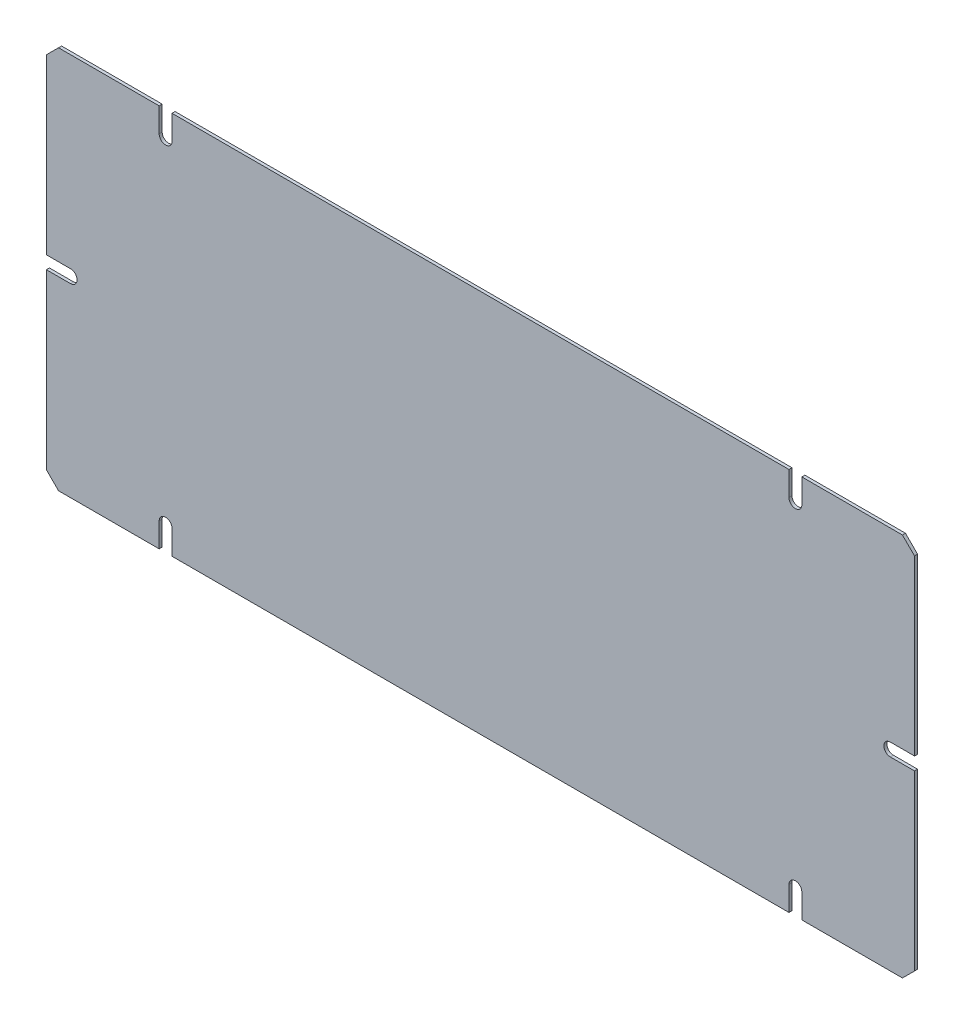
ISO-10303-21;
HEADER;
FILE_DESCRIPTION(('STEP AP214'),'2;1');
FILE_NAME('part.step','',(''),(''),'','','');
FILE_SCHEMA(('AUTOMOTIVE_DESIGN { 1 0 10303 214 1 1 1 1 }'));
ENDSEC;
DATA;
#1=APPLICATION_CONTEXT('core data for automotive mechanical design processes');
#2=APPLICATION_PROTOCOL_DEFINITION('international standard','automotive_design',2000,#1);
#3=PRODUCT_CONTEXT('',#1,'mechanical');
#4=PRODUCT('Part','Part','',(#3));
#5=PRODUCT_RELATED_PRODUCT_CATEGORY('part','',(#4));
#6=PRODUCT_DEFINITION_FORMATION('','',#4);
#7=PRODUCT_DEFINITION_CONTEXT('part definition',#1,'design');
#8=PRODUCT_DEFINITION('design','',#6,#7);
#9=PRODUCT_DEFINITION_SHAPE('','',#8);
#10=(LENGTH_UNIT() NAMED_UNIT(*) SI_UNIT(.MILLI.,.METRE.));
#11=(NAMED_UNIT(*) PLANE_ANGLE_UNIT() SI_UNIT($,.RADIAN.));
#12=(NAMED_UNIT(*) SI_UNIT($,.STERADIAN.) SOLID_ANGLE_UNIT());
#13=UNCERTAINTY_MEASURE_WITH_UNIT(LENGTH_MEASURE(1.E-05),#10,'distance_accuracy_value','');
#14=(GEOMETRIC_REPRESENTATION_CONTEXT(3) GLOBAL_UNCERTAINTY_ASSIGNED_CONTEXT((#13)) GLOBAL_UNIT_ASSIGNED_CONTEXT((#10,
#11,#12)) REPRESENTATION_CONTEXT('',''));
#15=CARTESIAN_POINT('',(0.,0.,0.));
#16=DIRECTION('',(0.,0.,1.));
#17=DIRECTION('',(1.,0.,0.));
#18=AXIS2_PLACEMENT_3D('',#15,#16,#17);
#19=CARTESIAN_POINT('',(0.,0.,1.5875));
#20=DIRECTION('',(0.,0.,1.));
#21=DIRECTION('',(1.,0.,0.));
#22=AXIS2_PLACEMENT_3D('',#19,#20,#21);
#23=PLANE('',#22);
#24=CARTESIAN_POINT('',(214.884,0.,1.5875));
#25=DIRECTION('',(0.,0.,1.));
#26=DIRECTION('',(1.,0.,0.));
#27=AXIS2_PLACEMENT_3D('',#24,#25,#26);
#28=CIRCLE('',#27,3.3782);
#29=CARTESIAN_POINT('',(214.884,3.37820000000003,1.5875));
#30=VERTEX_POINT('',#29);
#31=CARTESIAN_POINT('',(214.884,-3.37819999999997,1.5875));
#32=VERTEX_POINT('',#31);
#33=EDGE_CURVE('E276',#30,#32,#28,.T.);
#34=ORIENTED_EDGE('',*,*,#33,.F.);
#35=DIRECTION('',(1.,0.,0.));
#36=VECTOR('',#35,1.);
#37=CARTESIAN_POINT('',(214.884,3.37820000000003,1.5875));
#38=LINE('',#37,#36);
#39=CARTESIAN_POINT('',(227.584,3.37820000000003,1.5875));
#40=VERTEX_POINT('',#39);
#41=EDGE_CURVE('E61',#30,#40,#38,.T.);
#42=ORIENTED_EDGE('',*,*,#41,.T.);
#43=DIRECTION('',(0.,1.,0.));
#44=VECTOR('',#43,1.);
#45=CARTESIAN_POINT('',(227.584,100.584,1.5875));
#46=LINE('',#45,#44);
#47=CARTESIAN_POINT('',(227.584,94.2340000000001,1.5875));
#48=VERTEX_POINT('',#47);
#49=EDGE_CURVE('E303',#40,#48,#46,.T.);
#50=ORIENTED_EDGE('',*,*,#49,.T.);
#51=DIRECTION('',(0.707106781186548,-0.707106781186548,0.));
#52=VECTOR('',#51,1.);
#53=CARTESIAN_POINT('',(160.909,160.909,1.5875));
#54=LINE('',#53,#52);
#55=CARTESIAN_POINT('',(221.234,100.584,1.5875));
#56=VERTEX_POINT('',#55);
#57=EDGE_CURVE('E357',#48,#56,#54,.F.);
#58=ORIENTED_EDGE('',*,*,#57,.T.);
#59=DIRECTION('',(-1.,0.,0.));
#60=VECTOR('',#59,1.);
#61=CARTESIAN_POINT('',(-227.584,100.584,1.5875));
#62=LINE('',#61,#60);
#63=CARTESIAN_POINT('',(168.4782,100.584,1.5875));
#64=VERTEX_POINT('',#63);
#65=EDGE_CURVE('E304',#56,#64,#62,.T.);
#66=ORIENTED_EDGE('',*,*,#65,.T.);
#67=DIRECTION('',(0.,1.,0.));
#68=VECTOR('',#67,1.);
#69=CARTESIAN_POINT('',(168.4782,87.884,1.5875));
#70=LINE('',#69,#68);
#71=CARTESIAN_POINT('',(168.4782,87.884,1.5875));
#72=VERTEX_POINT('',#71);
#73=EDGE_CURVE('E402',#72,#64,#70,.T.);
#74=ORIENTED_EDGE('',*,*,#73,.F.);
#75=CARTESIAN_POINT('',(165.1,87.884,1.5875));
#76=DIRECTION('',(0.,0.,1.));
#77=DIRECTION('',(1.,0.,0.));
#78=AXIS2_PLACEMENT_3D('',#75,#76,#77);
#79=CIRCLE('',#78,3.3782);
#80=CARTESIAN_POINT('',(161.7218,87.884,1.5875));
#81=VERTEX_POINT('',#80);
#82=EDGE_CURVE('E412',#81,#72,#79,.T.);
#83=ORIENTED_EDGE('',*,*,#82,.F.);
#84=DIRECTION('',(0.,-1.,0.));
#85=VECTOR('',#84,1.);
#86=CARTESIAN_POINT('',(161.7218,87.884,1.5875));
#87=LINE('',#86,#85);
#88=CARTESIAN_POINT('',(161.7218,100.584,1.5875));
#89=VERTEX_POINT('',#88);
#90=EDGE_CURVE('E400',#89,#81,#87,.T.);
#91=ORIENTED_EDGE('',*,*,#90,.F.);
#92=CARTESIAN_POINT('',(-161.7218,100.584,1.5875));
#93=VERTEX_POINT('',#92);
#94=EDGE_CURVE('E308',#89,#93,#62,.T.);
#95=ORIENTED_EDGE('',*,*,#94,.T.);
#96=DIRECTION('',(0.,1.,0.));
#97=VECTOR('',#96,1.);
#98=CARTESIAN_POINT('',(-161.7218,87.884,1.5875));
#99=LINE('',#98,#97);
#100=CARTESIAN_POINT('',(-161.7218,87.884,1.5875));
#101=VERTEX_POINT('',#100);
#102=EDGE_CURVE('E409',#101,#93,#99,.T.);
#103=ORIENTED_EDGE('',*,*,#102,.F.);
#104=CARTESIAN_POINT('',(-165.1,87.884,1.5875));
#105=DIRECTION('',(0.,0.,1.));
#106=DIRECTION('',(1.,0.,0.));
#107=AXIS2_PLACEMENT_3D('',#104,#105,#106);
#108=CIRCLE('',#107,3.3782);
#109=CARTESIAN_POINT('',(-168.4782,87.884,1.5875));
#110=VERTEX_POINT('',#109);
#111=EDGE_CURVE('E405',#110,#101,#108,.T.);
#112=ORIENTED_EDGE('',*,*,#111,.F.);
#113=DIRECTION('',(0.,-1.,0.));
#114=VECTOR('',#113,1.);
#115=CARTESIAN_POINT('',(-168.4782,87.884,1.5875));
#116=LINE('',#115,#114);
#117=CARTESIAN_POINT('',(-168.4782,100.584,1.5875));
#118=VERTEX_POINT('',#117);
#119=EDGE_CURVE('E440',#118,#110,#116,.T.);
#120=ORIENTED_EDGE('',*,*,#119,.F.);
#121=CARTESIAN_POINT('',(-221.234,100.584,1.5875));
#122=VERTEX_POINT('',#121);
#123=EDGE_CURVE('E302',#118,#122,#62,.T.);
#124=ORIENTED_EDGE('',*,*,#123,.T.);
#125=DIRECTION('',(0.707106781186548,0.707106781186548,0.));
#126=VECTOR('',#125,1.);
#127=CARTESIAN_POINT('',(-160.909,160.909,1.5875));
#128=LINE('',#127,#126);
#129=CARTESIAN_POINT('',(-227.584,94.2340000000001,1.5875));
#130=VERTEX_POINT('',#129);
#131=EDGE_CURVE('E361',#122,#130,#128,.F.);
#132=ORIENTED_EDGE('',*,*,#131,.T.);
#133=DIRECTION('',(0.,-1.,0.));
#134=VECTOR('',#133,1.);
#135=CARTESIAN_POINT('',(-227.584,100.584,1.5875));
#136=LINE('',#135,#134);
#137=CARTESIAN_POINT('',(-227.584,3.37820000000003,1.5875));
#138=VERTEX_POINT('',#137);
#139=EDGE_CURVE('E309',#130,#138,#136,.T.);
#140=ORIENTED_EDGE('',*,*,#139,.T.);
#141=DIRECTION('',(-1.,0.,0.));
#142=VECTOR('',#141,1.);
#143=CARTESIAN_POINT('',(-214.884,3.37820000000003,1.5875));
#144=LINE('',#143,#142);
#145=CARTESIAN_POINT('',(-214.884,3.37820000000003,1.5875));
#146=VERTEX_POINT('',#145);
#147=EDGE_CURVE('E465',#146,#138,#144,.T.);
#148=ORIENTED_EDGE('',*,*,#147,.F.);
#149=CARTESIAN_POINT('',(-214.884,0.,1.5875));
#150=DIRECTION('',(0.,0.,1.));
#151=DIRECTION('',(1.,0.,0.));
#152=AXIS2_PLACEMENT_3D('',#149,#150,#151);
#153=CIRCLE('',#152,3.3782);
#154=CARTESIAN_POINT('',(-214.884,-3.37819999999997,1.5875));
#155=VERTEX_POINT('',#154);
#156=EDGE_CURVE('E275',#155,#146,#153,.T.);
#157=ORIENTED_EDGE('',*,*,#156,.F.);
#158=DIRECTION('',(1.,0.,0.));
#159=VECTOR('',#158,1.);
#160=CARTESIAN_POINT('',(-214.884,-3.37819999999997,1.5875));
#161=LINE('',#160,#159);
#162=CARTESIAN_POINT('',(-227.584,-3.37819999999997,1.5875));
#163=VERTEX_POINT('',#162);
#164=EDGE_CURVE('E460',#163,#155,#161,.T.);
#165=ORIENTED_EDGE('',*,*,#164,.F.);
#166=CARTESIAN_POINT('',(-227.584,-94.234,1.5875));
#167=VERTEX_POINT('',#166);
#168=EDGE_CURVE('E307',#163,#167,#136,.T.);
#169=ORIENTED_EDGE('',*,*,#168,.T.);
#170=DIRECTION('',(-0.707106781186548,0.707106781186548,0.));
#171=VECTOR('',#170,1.);
#172=CARTESIAN_POINT('',(-160.909,-160.909,1.5875));
#173=LINE('',#172,#171);
#174=CARTESIAN_POINT('',(-221.234,-100.584,1.5875));
#175=VERTEX_POINT('',#174);
#176=EDGE_CURVE('E363',#167,#175,#173,.F.);
#177=ORIENTED_EDGE('',*,*,#176,.T.);
#178=DIRECTION('',(1.,0.,0.));
#179=VECTOR('',#178,1.);
#180=CARTESIAN_POINT('',(-227.584,-100.584,1.5875));
#181=LINE('',#180,#179);
#182=CARTESIAN_POINT('',(-168.4782,-100.584,1.5875));
#183=VERTEX_POINT('',#182);
#184=EDGE_CURVE('E313',#175,#183,#181,.T.);
#185=ORIENTED_EDGE('',*,*,#184,.T.);
#186=DIRECTION('',(0.,1.,0.));
#187=VECTOR('',#186,1.);
#188=CARTESIAN_POINT('',(-168.4782,-87.884,1.5875));
#189=LINE('',#188,#187);
#190=CARTESIAN_POINT('',(-168.4782,-87.884,1.5875));
#191=VERTEX_POINT('',#190);
#192=EDGE_CURVE('E485',#183,#191,#189,.T.);
#193=ORIENTED_EDGE('',*,*,#192,.T.);
#194=CARTESIAN_POINT('',(-165.1,-87.884,1.5875));
#195=DIRECTION('',(0.,0.,1.));
#196=DIRECTION('',(1.,0.,0.));
#197=AXIS2_PLACEMENT_3D('',#194,#195,#196);
#198=CIRCLE('',#197,3.3782);
#199=CARTESIAN_POINT('',(-161.7218,-87.884,1.5875));
#200=VERTEX_POINT('',#199);
#201=EDGE_CURVE('E287',#200,#191,#198,.T.);
#202=ORIENTED_EDGE('',*,*,#201,.F.);
#203=DIRECTION('',(0.,-1.,0.));
#204=VECTOR('',#203,1.);
#205=CARTESIAN_POINT('',(-161.7218,-87.884,1.5875));
#206=LINE('',#205,#204);
#207=CARTESIAN_POINT('',(-161.7218,-100.584,1.5875));
#208=VERTEX_POINT('',#207);
#209=EDGE_CURVE('E488',#200,#208,#206,.T.);
#210=ORIENTED_EDGE('',*,*,#209,.T.);
#211=CARTESIAN_POINT('',(161.7218,-100.584,1.5875));
#212=VERTEX_POINT('',#211);
#213=EDGE_CURVE('E317',#208,#212,#181,.T.);
#214=ORIENTED_EDGE('',*,*,#213,.T.);
#215=DIRECTION('',(0.,1.,0.));
#216=VECTOR('',#215,1.);
#217=CARTESIAN_POINT('',(161.7218,-87.884,1.5875));
#218=LINE('',#217,#216);
#219=CARTESIAN_POINT('',(161.7218,-87.884,1.5875));
#220=VERTEX_POINT('',#219);
#221=EDGE_CURVE('E505',#212,#220,#218,.T.);
#222=ORIENTED_EDGE('',*,*,#221,.T.);
#223=CARTESIAN_POINT('',(165.1,-87.884,1.5875));
#224=DIRECTION('',(0.,0.,1.));
#225=DIRECTION('',(1.,0.,0.));
#226=AXIS2_PLACEMENT_3D('',#223,#224,#225);
#227=CIRCLE('',#226,3.3782);
#228=CARTESIAN_POINT('',(168.4782,-87.884,1.5875));
#229=VERTEX_POINT('',#228);
#230=EDGE_CURVE('E293',#229,#220,#227,.T.);
#231=ORIENTED_EDGE('',*,*,#230,.F.);
#232=DIRECTION('',(0.,-1.,0.));
#233=VECTOR('',#232,1.);
#234=CARTESIAN_POINT('',(168.4782,-87.884,1.5875));
#235=LINE('',#234,#233);
#236=CARTESIAN_POINT('',(168.4782,-100.584,1.5875));
#237=VERTEX_POINT('',#236);
#238=EDGE_CURVE('E508',#229,#237,#235,.T.);
#239=ORIENTED_EDGE('',*,*,#238,.T.);
#240=CARTESIAN_POINT('',(221.234,-100.584,1.5875));
#241=VERTEX_POINT('',#240);
#242=EDGE_CURVE('E312',#237,#241,#181,.T.);
#243=ORIENTED_EDGE('',*,*,#242,.T.);
#244=DIRECTION('',(-0.707106781186548,-0.707106781186548,0.));
#245=VECTOR('',#244,1.);
#246=CARTESIAN_POINT('',(160.909,-160.909,1.5875));
#247=LINE('',#246,#245);
#248=CARTESIAN_POINT('',(227.584,-94.2340000000001,1.5875));
#249=VERTEX_POINT('',#248);
#250=EDGE_CURVE('E359',#241,#249,#247,.F.);
#251=ORIENTED_EDGE('',*,*,#250,.T.);
#252=CARTESIAN_POINT('',(227.584,-3.37819999999997,1.5875));
#253=VERTEX_POINT('',#252);
#254=EDGE_CURVE('E299',#249,#253,#46,.T.);
#255=ORIENTED_EDGE('',*,*,#254,.T.);
#256=DIRECTION('',(-1.,0.,0.));
#257=VECTOR('',#256,1.);
#258=CARTESIAN_POINT('',(214.884,-3.37819999999997,1.5875));
#259=LINE('',#258,#257);
#260=EDGE_CURVE('E271',#253,#32,#259,.T.);
#261=ORIENTED_EDGE('',*,*,#260,.T.);
#262=EDGE_LOOP('',(#34,#42,#50,#58,#66,#74,#83,#91,#95,#103,#112,#120,#124,#132,#140,#148,#157,
#165,#169,#177,#185,#193,#202,#210,#214,#222,#231,#239,#243,#251,#255,#261));
#263=FACE_BOUND('',#262,.T.);
#264=ADVANCED_FACE('F46',(#263),#23,.T.);
#265=CARTESIAN_POINT('',(0.,0.,0.));
#266=DIRECTION('',(0.,0.,1.));
#267=DIRECTION('',(1.,0.,0.));
#268=AXIS2_PLACEMENT_3D('',#265,#266,#267);
#269=PLANE('',#268);
#270=DIRECTION('',(-1.,0.,0.));
#271=VECTOR('',#270,1.);
#272=CARTESIAN_POINT('',(214.884,3.37820000000003,0.));
#273=LINE('',#272,#271);
#274=CARTESIAN_POINT('',(227.584,3.37819999999998,0.));
#275=VERTEX_POINT('',#274);
#276=CARTESIAN_POINT('',(214.884,3.37820000000003,0.));
#277=VERTEX_POINT('',#276);
#278=EDGE_CURVE('E255',#275,#277,#273,.T.);
#279=ORIENTED_EDGE('',*,*,#278,.T.);
#280=CARTESIAN_POINT('',(214.884,0.,0.));
#281=DIRECTION('',(0.,0.,1.));
#282=DIRECTION('',(1.,0.,0.));
#283=AXIS2_PLACEMENT_3D('',#280,#281,#282);
#284=CIRCLE('',#283,3.3782);
#285=CARTESIAN_POINT('',(214.884,-3.37819999999997,0.));
#286=VERTEX_POINT('',#285);
#287=EDGE_CURVE('E268',#277,#286,#284,.T.);
#288=ORIENTED_EDGE('',*,*,#287,.T.);
#289=DIRECTION('',(1.,0.,0.));
#290=VECTOR('',#289,1.);
#291=CARTESIAN_POINT('',(214.884,-3.37819999999997,0.));
#292=LINE('',#291,#290);
#293=CARTESIAN_POINT('',(227.584,-3.37819999999997,0.));
#294=VERTEX_POINT('',#293);
#295=EDGE_CURVE('E69',#286,#294,#292,.T.);
#296=ORIENTED_EDGE('',*,*,#295,.T.);
#297=DIRECTION('',(0.,1.,0.));
#298=VECTOR('',#297,1.);
#299=CARTESIAN_POINT('',(227.584,100.584,0.));
#300=LINE('',#299,#298);
#301=CARTESIAN_POINT('',(227.584,-94.2340000000001,0.));
#302=VERTEX_POINT('',#301);
#303=EDGE_CURVE('E318',#302,#294,#300,.T.);
#304=ORIENTED_EDGE('',*,*,#303,.F.);
#305=DIRECTION('',(0.707106781186548,0.707106781186548,0.));
#306=VECTOR('',#305,1.);
#307=CARTESIAN_POINT('',(227.584,-94.2340000000001,0.));
#308=LINE('',#307,#306);
#309=CARTESIAN_POINT('',(221.234,-100.584,0.));
#310=VERTEX_POINT('',#309);
#311=EDGE_CURVE('E342',#302,#310,#308,.F.);
#312=ORIENTED_EDGE('',*,*,#311,.T.);
#313=DIRECTION('',(1.,0.,0.));
#314=VECTOR('',#313,1.);
#315=CARTESIAN_POINT('',(-227.584,-100.584,0.));
#316=LINE('',#315,#314);
#317=CARTESIAN_POINT('',(168.4782,-100.584,0.));
#318=VERTEX_POINT('',#317);
#319=EDGE_CURVE('E330',#318,#310,#316,.T.);
#320=ORIENTED_EDGE('',*,*,#319,.F.);
#321=DIRECTION('',(0.,1.,0.));
#322=VECTOR('',#321,1.);
#323=CARTESIAN_POINT('',(168.4782,-87.884,0.));
#324=LINE('',#323,#322);
#325=CARTESIAN_POINT('',(168.4782,-87.884,0.));
#326=VERTEX_POINT('',#325);
#327=EDGE_CURVE('E473',#318,#326,#324,.T.);
#328=ORIENTED_EDGE('',*,*,#327,.T.);
#329=CARTESIAN_POINT('',(165.1,-87.884,0.));
#330=DIRECTION('',(0.,0.,1.));
#331=DIRECTION('',(1.,0.,0.));
#332=AXIS2_PLACEMENT_3D('',#329,#330,#331);
#333=CIRCLE('',#332,3.3782);
#334=CARTESIAN_POINT('',(161.7218,-87.884,0.));
#335=VERTEX_POINT('',#334);
#336=EDGE_CURVE('E296',#326,#335,#333,.T.);
#337=ORIENTED_EDGE('',*,*,#336,.T.);
#338=DIRECTION('',(0.,-1.,0.));
#339=VECTOR('',#338,1.);
#340=CARTESIAN_POINT('',(161.7218,-87.884,0.));
#341=LINE('',#340,#339);
#342=CARTESIAN_POINT('',(161.7218,-100.584,0.));
#343=VERTEX_POINT('',#342);
#344=EDGE_CURVE('E502',#335,#343,#341,.T.);
#345=ORIENTED_EDGE('',*,*,#344,.T.);
#346=CARTESIAN_POINT('',(-161.7218,-100.584,0.));
#347=VERTEX_POINT('',#346);
#348=EDGE_CURVE('E334',#347,#343,#316,.T.);
#349=ORIENTED_EDGE('',*,*,#348,.F.);
#350=DIRECTION('',(0.,1.,0.));
#351=VECTOR('',#350,1.);
#352=CARTESIAN_POINT('',(-161.7218,-87.884,0.));
#353=LINE('',#352,#351);
#354=CARTESIAN_POINT('',(-161.7218,-87.884,0.));
#355=VERTEX_POINT('',#354);
#356=EDGE_CURVE('E491',#347,#355,#353,.T.);
#357=ORIENTED_EDGE('',*,*,#356,.T.);
#358=CARTESIAN_POINT('',(-165.1,-87.884,0.));
#359=DIRECTION('',(0.,0.,1.));
#360=DIRECTION('',(1.,0.,0.));
#361=AXIS2_PLACEMENT_3D('',#358,#359,#360);
#362=CIRCLE('',#361,3.3782);
#363=CARTESIAN_POINT('',(-168.4782,-87.884,0.));
#364=VERTEX_POINT('',#363);
#365=EDGE_CURVE('E290',#355,#364,#362,.T.);
#366=ORIENTED_EDGE('',*,*,#365,.T.);
#367=DIRECTION('',(0.,-1.,0.));
#368=VECTOR('',#367,1.);
#369=CARTESIAN_POINT('',(-168.4782,-87.884,0.));
#370=LINE('',#369,#368);
#371=CARTESIAN_POINT('',(-168.4782,-100.584,0.));
#372=VERTEX_POINT('',#371);
#373=EDGE_CURVE('E482',#364,#372,#370,.T.);
#374=ORIENTED_EDGE('',*,*,#373,.T.);
#375=CARTESIAN_POINT('',(-221.234,-100.584,0.));
#376=VERTEX_POINT('',#375);
#377=EDGE_CURVE('E331',#376,#372,#316,.T.);
#378=ORIENTED_EDGE('',*,*,#377,.F.);
#379=DIRECTION('',(0.707106781186548,-0.707106781186548,0.));
#380=VECTOR('',#379,1.);
#381=CARTESIAN_POINT('',(-221.234,-100.584,0.));
#382=LINE('',#381,#380);
#383=CARTESIAN_POINT('',(-227.584,-94.234,0.));
#384=VERTEX_POINT('',#383);
#385=EDGE_CURVE('E348',#376,#384,#382,.F.);
#386=ORIENTED_EDGE('',*,*,#385,.T.);
#387=DIRECTION('',(0.,-1.,0.));
#388=VECTOR('',#387,1.);
#389=CARTESIAN_POINT('',(-227.584,100.584,0.));
#390=LINE('',#389,#388);
#391=CARTESIAN_POINT('',(-227.584,-3.37819999999997,0.));
#392=VERTEX_POINT('',#391);
#393=EDGE_CURVE('E325',#392,#384,#390,.T.);
#394=ORIENTED_EDGE('',*,*,#393,.F.);
#395=DIRECTION('',(-1.,0.,0.));
#396=VECTOR('',#395,1.);
#397=CARTESIAN_POINT('',(-214.884,-3.37819999999997,0.));
#398=LINE('',#397,#396);
#399=CARTESIAN_POINT('',(-214.884,-3.37819999999997,0.));
#400=VERTEX_POINT('',#399);
#401=EDGE_CURVE('E603',#400,#392,#398,.T.);
#402=ORIENTED_EDGE('',*,*,#401,.F.);
#403=CARTESIAN_POINT('',(-214.884,0.,0.));
#404=DIRECTION('',(0.,0.,1.));
#405=DIRECTION('',(1.,0.,0.));
#406=AXIS2_PLACEMENT_3D('',#403,#404,#405);
#407=CIRCLE('',#406,3.3782);
#408=CARTESIAN_POINT('',(-214.884,3.37820000000003,0.));
#409=VERTEX_POINT('',#408);
#410=EDGE_CURVE('E279',#400,#409,#407,.T.);
#411=ORIENTED_EDGE('',*,*,#410,.T.);
#412=DIRECTION('',(1.,0.,0.));
#413=VECTOR('',#412,1.);
#414=CARTESIAN_POINT('',(-214.884,3.37820000000003,0.));
#415=LINE('',#414,#413);
#416=CARTESIAN_POINT('',(-227.584,3.37819999999998,0.));
#417=VERTEX_POINT('',#416);
#418=EDGE_CURVE('E454',#417,#409,#415,.T.);
#419=ORIENTED_EDGE('',*,*,#418,.F.);
#420=CARTESIAN_POINT('',(-227.584,94.2340000000001,0.));
#421=VERTEX_POINT('',#420);
#422=EDGE_CURVE('E327',#421,#417,#390,.T.);
#423=ORIENTED_EDGE('',*,*,#422,.F.);
#424=DIRECTION('',(-0.707106781186548,-0.707106781186548,0.));
#425=VECTOR('',#424,1.);
#426=CARTESIAN_POINT('',(-227.584,94.2340000000001,0.));
#427=LINE('',#426,#425);
#428=CARTESIAN_POINT('',(-221.234,100.584,0.));
#429=VERTEX_POINT('',#428);
#430=EDGE_CURVE('E345',#421,#429,#427,.F.);
#431=ORIENTED_EDGE('',*,*,#430,.T.);
#432=DIRECTION('',(-1.,0.,0.));
#433=VECTOR('',#432,1.);
#434=CARTESIAN_POINT('',(-227.584,100.584,0.));
#435=LINE('',#434,#433);
#436=CARTESIAN_POINT('',(-168.4782,100.584,0.));
#437=VERTEX_POINT('',#436);
#438=EDGE_CURVE('E321',#437,#429,#435,.T.);
#439=ORIENTED_EDGE('',*,*,#438,.F.);
#440=DIRECTION('',(0.,1.,0.));
#441=VECTOR('',#440,1.);
#442=CARTESIAN_POINT('',(-168.4782,87.884,0.));
#443=LINE('',#442,#441);
#444=CARTESIAN_POINT('',(-168.4782,87.884,0.));
#445=VERTEX_POINT('',#444);
#446=EDGE_CURVE('E521',#445,#437,#443,.T.);
#447=ORIENTED_EDGE('',*,*,#446,.F.);
#448=CARTESIAN_POINT('',(-165.1,87.884,0.));
#449=DIRECTION('',(0.,0.,1.));
#450=DIRECTION('',(1.,0.,0.));
#451=AXIS2_PLACEMENT_3D('',#448,#449,#450);
#452=CIRCLE('',#451,3.3782);
#453=CARTESIAN_POINT('',(-161.7218,87.884,0.));
#454=VERTEX_POINT('',#453);
#455=EDGE_CURVE('E408',#445,#454,#452,.T.);
#456=ORIENTED_EDGE('',*,*,#455,.T.);
#457=DIRECTION('',(0.,-1.,0.));
#458=VECTOR('',#457,1.);
#459=CARTESIAN_POINT('',(-161.7218,87.884,0.));
#460=LINE('',#459,#458);
#461=CARTESIAN_POINT('',(-161.7218,100.584,0.));
#462=VERTEX_POINT('',#461);
#463=EDGE_CURVE('E519',#462,#454,#460,.T.);
#464=ORIENTED_EDGE('',*,*,#463,.F.);
#465=CARTESIAN_POINT('',(161.7218,100.584,0.));
#466=VERTEX_POINT('',#465);
#467=EDGE_CURVE('E326',#466,#462,#435,.T.);
#468=ORIENTED_EDGE('',*,*,#467,.F.);
#469=DIRECTION('',(0.,1.,0.));
#470=VECTOR('',#469,1.);
#471=CARTESIAN_POINT('',(161.7218,87.884,0.));
#472=LINE('',#471,#470);
#473=CARTESIAN_POINT('',(161.7218,87.884,0.));
#474=VERTEX_POINT('',#473);
#475=EDGE_CURVE('E398',#474,#466,#472,.T.);
#476=ORIENTED_EDGE('',*,*,#475,.F.);
#477=CARTESIAN_POINT('',(165.1,87.884,0.));
#478=DIRECTION('',(0.,0.,1.));
#479=DIRECTION('',(1.,0.,0.));
#480=AXIS2_PLACEMENT_3D('',#477,#478,#479);
#481=CIRCLE('',#480,3.3782);
#482=CARTESIAN_POINT('',(168.4782,87.884,0.));
#483=VERTEX_POINT('',#482);
#484=EDGE_CURVE('E281',#474,#483,#481,.T.);
#485=ORIENTED_EDGE('',*,*,#484,.T.);
#486=DIRECTION('',(0.,-1.,0.));
#487=VECTOR('',#486,1.);
#488=CARTESIAN_POINT('',(168.4782,87.884,0.));
#489=LINE('',#488,#487);
#490=CARTESIAN_POINT('',(168.4782,100.584,0.));
#491=VERTEX_POINT('',#490);
#492=EDGE_CURVE('E391',#491,#483,#489,.T.);
#493=ORIENTED_EDGE('',*,*,#492,.F.);
#494=CARTESIAN_POINT('',(221.234,100.584,0.));
#495=VERTEX_POINT('',#494);
#496=EDGE_CURVE('E322',#495,#491,#435,.T.);
#497=ORIENTED_EDGE('',*,*,#496,.F.);
#498=DIRECTION('',(-0.707106781186548,0.707106781186548,0.));
#499=VECTOR('',#498,1.);
#500=CARTESIAN_POINT('',(221.234,100.584,0.));
#501=LINE('',#500,#499);
#502=CARTESIAN_POINT('',(227.584,94.2340000000001,0.));
#503=VERTEX_POINT('',#502);
#504=EDGE_CURVE('E340',#495,#503,#501,.F.);
#505=ORIENTED_EDGE('',*,*,#504,.T.);
#506=EDGE_CURVE('E270',#275,#503,#300,.T.);
#507=ORIENTED_EDGE('',*,*,#506,.F.);
#508=EDGE_LOOP('',(#279,#288,#296,#304,#312,#320,#328,#337,#345,#349,#357,#366,#374,#378,#386,
#394,#402,#411,#419,#423,#431,#439,#447,#456,#464,#468,#476,#485,#493,#497,#505,#507));
#509=FACE_BOUND('',#508,.T.);
#510=ADVANCED_FACE('F267',(#509),#269,.F.);
#511=CARTESIAN_POINT('',(227.584,100.584,1.5875));
#512=DIRECTION('',(-1.,0.,0.));
#513=DIRECTION('',(0.,0.,1.));
#514=AXIS2_PLACEMENT_3D('',#511,#512,#513);
#515=PLANE('',#514);
#516=DIRECTION('',(0.,0.,-1.));
#517=VECTOR('',#516,1.);
#518=CARTESIAN_POINT('',(227.584,3.37819999999999,-0.000999999999999916));
#519=LINE('',#518,#517);
#520=EDGE_CURVE('E272',#40,#275,#519,.T.);
#521=ORIENTED_EDGE('',*,*,#520,.T.);
#522=ORIENTED_EDGE('',*,*,#506,.T.);
#523=DIRECTION('',(0.,0.,1.));
#524=VECTOR('',#523,1.);
#525=CARTESIAN_POINT('',(227.584,94.2340000000001,1.5875));
#526=LINE('',#525,#524);
#527=EDGE_CURVE('E54',#503,#48,#526,.T.);
#528=ORIENTED_EDGE('',*,*,#527,.T.);
#529=ORIENTED_EDGE('',*,*,#49,.F.);
#530=EDGE_LOOP('',(#521,#522,#528,#529));
#531=FACE_BOUND('',#530,.T.);
#532=ADVANCED_FACE('F375',(#531),#515,.F.);
#533=DIRECTION('',(0.,0.,1.));
#534=VECTOR('',#533,1.);
#535=CARTESIAN_POINT('',(227.584,-3.37819999999996,-0.000999999999999916));
#536=LINE('',#535,#534);
#537=EDGE_CURVE('E261',#294,#253,#536,.T.);
#538=ORIENTED_EDGE('',*,*,#537,.T.);
#539=ORIENTED_EDGE('',*,*,#254,.F.);
#540=DIRECTION('',(0.,0.,-1.));
#541=VECTOR('',#540,1.);
#542=CARTESIAN_POINT('',(227.584,-94.2340000000001,1.5875));
#543=LINE('',#542,#541);
#544=EDGE_CURVE('E13',#249,#302,#543,.T.);
#545=ORIENTED_EDGE('',*,*,#544,.T.);
#546=ORIENTED_EDGE('',*,*,#303,.T.);
#547=EDGE_LOOP('',(#538,#539,#545,#546));
#548=FACE_BOUND('',#547,.T.);
#549=ADVANCED_FACE('F564',(#548),#515,.F.);
#550=CARTESIAN_POINT('',(214.884,0.,1.5875));
#551=DIRECTION('',(0.,0.,1.));
#552=DIRECTION('',(1.,0.,0.));
#553=AXIS2_PLACEMENT_3D('',#550,#551,#552);
#554=CYLINDRICAL_SURFACE('',#553,3.3782);
#555=DIRECTION('',(0.,0.,1.));
#556=VECTOR('',#555,1.);
#557=CARTESIAN_POINT('',(214.884,3.37820000000003,1.5875));
#558=LINE('',#557,#556);
#559=EDGE_CURVE('E252',#277,#30,#558,.T.);
#560=ORIENTED_EDGE('',*,*,#559,.T.);
#561=ORIENTED_EDGE('',*,*,#33,.T.);
#562=DIRECTION('',(0.,0.,1.));
#563=VECTOR('',#562,1.);
#564=CARTESIAN_POINT('',(214.884,-3.37819999999997,1.5875));
#565=LINE('',#564,#563);
#566=EDGE_CURVE('E262',#286,#32,#565,.T.);
#567=ORIENTED_EDGE('',*,*,#566,.F.);
#568=ORIENTED_EDGE('',*,*,#287,.F.);
#569=EDGE_LOOP('',(#560,#561,#567,#568));
#570=FACE_BOUND('',#569,.T.);
#571=ADVANCED_FACE('F274',(#570),#554,.F.);
#572=CARTESIAN_POINT('',(-227.584,100.584,1.5875));
#573=DIRECTION('',(1.,0.,0.));
#574=DIRECTION('',(0.,0.,-1.));
#575=AXIS2_PLACEMENT_3D('',#572,#573,#574);
#576=PLANE('',#575);
#577=ORIENTED_EDGE('',*,*,#168,.F.);
#578=DIRECTION('',(0.,0.,1.));
#579=VECTOR('',#578,1.);
#580=CARTESIAN_POINT('',(-227.584,-3.37819999999996,-0.000999999999999916));
#581=LINE('',#580,#579);
#582=EDGE_CURVE('E601',#392,#163,#581,.T.);
#583=ORIENTED_EDGE('',*,*,#582,.F.);
#584=ORIENTED_EDGE('',*,*,#393,.T.);
#585=DIRECTION('',(0.,0.,1.));
#586=VECTOR('',#585,1.);
#587=CARTESIAN_POINT('',(-227.584,-94.234,1.5875));
#588=LINE('',#587,#586);
#589=EDGE_CURVE('E354',#384,#167,#588,.T.);
#590=ORIENTED_EDGE('',*,*,#589,.T.);
#591=EDGE_LOOP('',(#577,#583,#584,#590));
#592=FACE_BOUND('',#591,.T.);
#593=ADVANCED_FACE('F558',(#592),#576,.F.);
#594=CARTESIAN_POINT('',(-214.884,0.,1.5875));
#595=DIRECTION('',(0.,0.,1.));
#596=DIRECTION('',(1.,0.,0.));
#597=AXIS2_PLACEMENT_3D('',#594,#595,#596);
#598=CYLINDRICAL_SURFACE('',#597,3.3782);
#599=DIRECTION('',(0.,0.,1.));
#600=VECTOR('',#599,1.);
#601=CARTESIAN_POINT('',(-214.884,-3.37819999999997,1.5875));
#602=LINE('',#601,#600);
#603=EDGE_CURVE('E596',#400,#155,#602,.T.);
#604=ORIENTED_EDGE('',*,*,#603,.T.);
#605=ORIENTED_EDGE('',*,*,#156,.T.);
#606=DIRECTION('',(0.,0.,1.));
#607=VECTOR('',#606,1.);
#608=CARTESIAN_POINT('',(-214.884,3.37820000000003,1.5875));
#609=LINE('',#608,#607);
#610=EDGE_CURVE('E594',#409,#146,#609,.T.);
#611=ORIENTED_EDGE('',*,*,#610,.F.);
#612=ORIENTED_EDGE('',*,*,#410,.F.);
#613=EDGE_LOOP('',(#604,#605,#611,#612));
#614=FACE_BOUND('',#613,.T.);
#615=ADVANCED_FACE('F553',(#614),#598,.F.);
#616=CARTESIAN_POINT('',(-227.584,-100.584,1.5875));
#617=DIRECTION('',(0.,1.,0.));
#618=DIRECTION('',(0.,0.,1.));
#619=AXIS2_PLACEMENT_3D('',#616,#617,#618);
#620=PLANE('',#619);
#621=DIRECTION('',(0.,0.,1.));
#622=VECTOR('',#621,1.);
#623=CARTESIAN_POINT('',(-168.4782,-100.584,-0.000999999999999916));
#624=LINE('',#623,#622);
#625=EDGE_CURVE('E479',#372,#183,#624,.T.);
#626=ORIENTED_EDGE('',*,*,#625,.T.);
#627=ORIENTED_EDGE('',*,*,#184,.F.);
#628=DIRECTION('',(0.,0.,-1.));
#629=VECTOR('',#628,1.);
#630=CARTESIAN_POINT('',(-221.234,-100.584,1.5875));
#631=LINE('',#630,#629);
#632=EDGE_CURVE('E337',#175,#376,#631,.T.);
#633=ORIENTED_EDGE('',*,*,#632,.T.);
#634=ORIENTED_EDGE('',*,*,#377,.T.);
#635=EDGE_LOOP('',(#626,#627,#633,#634));
#636=FACE_BOUND('',#635,.T.);
#637=ADVANCED_FACE('F549',(#636),#620,.F.);
#638=DIRECTION('',(0.,0.,-1.));
#639=VECTOR('',#638,1.);
#640=CARTESIAN_POINT('',(-161.7218,-100.584,-0.000999999999999916));
#641=LINE('',#640,#639);
#642=EDGE_CURVE('E476',#208,#347,#641,.T.);
#643=ORIENTED_EDGE('',*,*,#642,.T.);
#644=ORIENTED_EDGE('',*,*,#348,.T.);
#645=DIRECTION('',(0.,0.,1.));
#646=VECTOR('',#645,1.);
#647=CARTESIAN_POINT('',(161.7218,-100.584,-0.000999999999999916));
#648=LINE('',#647,#646);
#649=EDGE_CURVE('E499',#343,#212,#648,.T.);
#650=ORIENTED_EDGE('',*,*,#649,.T.);
#651=ORIENTED_EDGE('',*,*,#213,.F.);
#652=EDGE_LOOP('',(#643,#644,#650,#651));
#653=FACE_BOUND('',#652,.T.);
#654=ADVANCED_FACE('F552',(#653),#620,.F.);
#655=DIRECTION('',(0.,0.,-1.));
#656=VECTOR('',#655,1.);
#657=CARTESIAN_POINT('',(168.4782,-100.584,-0.000999999999999916));
#658=LINE('',#657,#656);
#659=EDGE_CURVE('E496',#237,#318,#658,.T.);
#660=ORIENTED_EDGE('',*,*,#659,.T.);
#661=ORIENTED_EDGE('',*,*,#319,.T.);
#662=DIRECTION('',(0.,0.,1.));
#663=VECTOR('',#662,1.);
#664=CARTESIAN_POINT('',(221.234,-100.584,1.5875));
#665=LINE('',#664,#663);
#666=EDGE_CURVE('E316',#310,#241,#665,.T.);
#667=ORIENTED_EDGE('',*,*,#666,.T.);
#668=ORIENTED_EDGE('',*,*,#242,.F.);
#669=EDGE_LOOP('',(#660,#661,#667,#668));
#670=FACE_BOUND('',#669,.T.);
#671=ADVANCED_FACE('F555',(#670),#620,.F.);
#672=CARTESIAN_POINT('',(-227.584,100.584,1.5875));
#673=DIRECTION('',(0.,-1.,0.));
#674=DIRECTION('',(0.,0.,-1.));
#675=AXIS2_PLACEMENT_3D('',#672,#673,#674);
#676=PLANE('',#675);
#677=ORIENTED_EDGE('',*,*,#123,.F.);
#678=DIRECTION('',(0.,0.,1.));
#679=VECTOR('',#678,1.);
#680=CARTESIAN_POINT('',(-168.4782,100.584,-0.000999999999999916));
#681=LINE('',#680,#679);
#682=EDGE_CURVE('E517',#437,#118,#681,.T.);
#683=ORIENTED_EDGE('',*,*,#682,.F.);
#684=ORIENTED_EDGE('',*,*,#438,.T.);
#685=DIRECTION('',(0.,0.,1.));
#686=VECTOR('',#685,1.);
#687=CARTESIAN_POINT('',(-221.234,100.584,1.5875));
#688=LINE('',#687,#686);
#689=EDGE_CURVE('E368',#429,#122,#688,.T.);
#690=ORIENTED_EDGE('',*,*,#689,.T.);
#691=EDGE_LOOP('',(#677,#683,#684,#690));
#692=FACE_BOUND('',#691,.T.);
#693=ADVANCED_FACE('F444',(#692),#676,.F.);
#694=ORIENTED_EDGE('',*,*,#467,.T.);
#695=DIRECTION('',(0.,0.,-1.));
#696=VECTOR('',#695,1.);
#697=CARTESIAN_POINT('',(-161.7218,100.584,-0.000999999999999916));
#698=LINE('',#697,#696);
#699=EDGE_CURVE('E434',#93,#462,#698,.T.);
#700=ORIENTED_EDGE('',*,*,#699,.F.);
#701=ORIENTED_EDGE('',*,*,#94,.F.);
#702=DIRECTION('',(0.,0.,1.));
#703=VECTOR('',#702,1.);
#704=CARTESIAN_POINT('',(161.7218,100.584,-0.000999999999999916));
#705=LINE('',#704,#703);
#706=EDGE_CURVE('E388',#466,#89,#705,.T.);
#707=ORIENTED_EDGE('',*,*,#706,.F.);
#708=EDGE_LOOP('',(#694,#700,#701,#707));
#709=FACE_BOUND('',#708,.T.);
#710=ADVANCED_FACE('F433',(#709),#676,.F.);
#711=CARTESIAN_POINT('',(165.1,87.884,1.5875));
#712=DIRECTION('',(0.,0.,1.));
#713=DIRECTION('',(1.,0.,0.));
#714=AXIS2_PLACEMENT_3D('',#711,#712,#713);
#715=CYLINDRICAL_SURFACE('',#714,3.3782);
#716=DIRECTION('',(0.,0.,1.));
#717=VECTOR('',#716,1.);
#718=CARTESIAN_POINT('',(161.7218,87.884,1.5875));
#719=LINE('',#718,#717);
#720=EDGE_CURVE('E393',#81,#474,#719,.F.);
#721=ORIENTED_EDGE('',*,*,#720,.F.);
#722=ORIENTED_EDGE('',*,*,#82,.T.);
#723=DIRECTION('',(0.,0.,1.));
#724=VECTOR('',#723,1.);
#725=CARTESIAN_POINT('',(168.4782,87.884,1.5875));
#726=LINE('',#725,#724);
#727=EDGE_CURVE('E389',#483,#72,#726,.T.);
#728=ORIENTED_EDGE('',*,*,#727,.F.);
#729=ORIENTED_EDGE('',*,*,#484,.F.);
#730=EDGE_LOOP('',(#721,#722,#728,#729));
#731=FACE_BOUND('',#730,.T.);
#732=ADVANCED_FACE('F421',(#731),#715,.F.);
#733=CARTESIAN_POINT('',(-165.1,87.884,1.5875));
#734=DIRECTION('',(0.,0.,1.));
#735=DIRECTION('',(1.,0.,0.));
#736=AXIS2_PLACEMENT_3D('',#733,#734,#735);
#737=CYLINDRICAL_SURFACE('',#736,3.3782);
#738=DIRECTION('',(0.,0.,1.));
#739=VECTOR('',#738,1.);
#740=CARTESIAN_POINT('',(-168.4782,87.884,1.5875));
#741=LINE('',#740,#739);
#742=EDGE_CURVE('E404',#110,#445,#741,.F.);
#743=ORIENTED_EDGE('',*,*,#742,.F.);
#744=ORIENTED_EDGE('',*,*,#111,.T.);
#745=DIRECTION('',(0.,0.,1.));
#746=VECTOR('',#745,1.);
#747=CARTESIAN_POINT('',(-161.7218,87.884,1.5875));
#748=LINE('',#747,#746);
#749=EDGE_CURVE('E514',#454,#101,#748,.T.);
#750=ORIENTED_EDGE('',*,*,#749,.F.);
#751=ORIENTED_EDGE('',*,*,#455,.F.);
#752=EDGE_LOOP('',(#743,#744,#750,#751));
#753=FACE_BOUND('',#752,.T.);
#754=ADVANCED_FACE('F561',(#753),#737,.F.);
#755=ORIENTED_EDGE('',*,*,#496,.T.);
#756=DIRECTION('',(0.,0.,-1.));
#757=VECTOR('',#756,1.);
#758=CARTESIAN_POINT('',(168.4782,100.584,-0.000999999999999916));
#759=LINE('',#758,#757);
#760=EDGE_CURVE('E385',#64,#491,#759,.T.);
#761=ORIENTED_EDGE('',*,*,#760,.F.);
#762=ORIENTED_EDGE('',*,*,#65,.F.);
#763=DIRECTION('',(0.,0.,-1.));
#764=VECTOR('',#763,1.);
#765=CARTESIAN_POINT('',(221.234,100.584,1.5875));
#766=LINE('',#765,#764);
#767=EDGE_CURVE('E365',#56,#495,#766,.T.);
#768=ORIENTED_EDGE('',*,*,#767,.T.);
#769=EDGE_LOOP('',(#755,#761,#762,#768));
#770=FACE_BOUND('',#769,.T.);
#771=ADVANCED_FACE('F383',(#770),#676,.F.);
#772=ORIENTED_EDGE('',*,*,#422,.T.);
#773=DIRECTION('',(0.,0.,-1.));
#774=VECTOR('',#773,1.);
#775=CARTESIAN_POINT('',(-227.584,3.37819999999999,-0.000999999999999916));
#776=LINE('',#775,#774);
#777=EDGE_CURVE('E599',#138,#417,#776,.T.);
#778=ORIENTED_EDGE('',*,*,#777,.F.);
#779=ORIENTED_EDGE('',*,*,#139,.F.);
#780=DIRECTION('',(0.,0.,-1.));
#781=VECTOR('',#780,1.);
#782=CARTESIAN_POINT('',(-227.584,94.2340000000001,1.5875));
#783=LINE('',#782,#781);
#784=EDGE_CURVE('E351',#130,#421,#783,.T.);
#785=ORIENTED_EDGE('',*,*,#784,.T.);
#786=EDGE_LOOP('',(#772,#778,#779,#785));
#787=FACE_BOUND('',#786,.T.);
#788=ADVANCED_FACE('F451',(#787),#576,.F.);
#789=CARTESIAN_POINT('',(165.1,-87.884,1.5875));
#790=DIRECTION('',(0.,0.,1.));
#791=DIRECTION('',(1.,0.,0.));
#792=AXIS2_PLACEMENT_3D('',#789,#790,#791);
#793=CYLINDRICAL_SURFACE('',#792,3.3782);
#794=ORIENTED_EDGE('',*,*,#230,.T.);
#795=DIRECTION('',(0.,0.,1.));
#796=VECTOR('',#795,1.);
#797=CARTESIAN_POINT('',(161.7218,-87.884,1.5875));
#798=LINE('',#797,#796);
#799=EDGE_CURVE('E463',#220,#335,#798,.F.);
#800=ORIENTED_EDGE('',*,*,#799,.T.);
#801=ORIENTED_EDGE('',*,*,#336,.F.);
#802=DIRECTION('',(0.,0.,1.));
#803=VECTOR('',#802,1.);
#804=CARTESIAN_POINT('',(168.4782,-87.884,1.5875));
#805=LINE('',#804,#803);
#806=EDGE_CURVE('E459',#326,#229,#805,.T.);
#807=ORIENTED_EDGE('',*,*,#806,.T.);
#808=EDGE_LOOP('',(#794,#800,#801,#807));
#809=FACE_BOUND('',#808,.T.);
#810=ADVANCED_FACE('F546',(#809),#793,.F.);
#811=CARTESIAN_POINT('',(-165.1,-87.884,1.5875));
#812=DIRECTION('',(0.,0.,1.));
#813=DIRECTION('',(1.,0.,0.));
#814=AXIS2_PLACEMENT_3D('',#811,#812,#813);
#815=CYLINDRICAL_SURFACE('',#814,3.3782);
#816=ORIENTED_EDGE('',*,*,#201,.T.);
#817=DIRECTION('',(0.,0.,1.));
#818=VECTOR('',#817,1.);
#819=CARTESIAN_POINT('',(-168.4782,-87.884,1.5875));
#820=LINE('',#819,#818);
#821=EDGE_CURVE('E472',#191,#364,#820,.F.);
#822=ORIENTED_EDGE('',*,*,#821,.T.);
#823=ORIENTED_EDGE('',*,*,#365,.F.);
#824=DIRECTION('',(0.,0.,1.));
#825=VECTOR('',#824,1.);
#826=CARTESIAN_POINT('',(-161.7218,-87.884,1.5875));
#827=LINE('',#826,#825);
#828=EDGE_CURVE('E469',#355,#200,#827,.T.);
#829=ORIENTED_EDGE('',*,*,#828,.T.);
#830=EDGE_LOOP('',(#816,#822,#823,#829));
#831=FACE_BOUND('',#830,.T.);
#832=ADVANCED_FACE('F568',(#831),#815,.F.);
#833=CARTESIAN_POINT('',(-221.234,-100.584,1.5875));
#834=DIRECTION('',(0.707106781186548,0.707106781186548,0.));
#835=DIRECTION('',(0.,0.,-1.));
#836=AXIS2_PLACEMENT_3D('',#833,#834,#835);
#837=PLANE('',#836);
#838=ORIENTED_EDGE('',*,*,#176,.F.);
#839=ORIENTED_EDGE('',*,*,#589,.F.);
#840=ORIENTED_EDGE('',*,*,#385,.F.);
#841=ORIENTED_EDGE('',*,*,#632,.F.);
#842=EDGE_LOOP('',(#838,#839,#840,#841));
#843=FACE_BOUND('',#842,.T.);
#844=ADVANCED_FACE('F565',(#843),#837,.F.);
#845=CARTESIAN_POINT('',(-227.584,94.2340000000001,1.5875));
#846=DIRECTION('',(0.707106781186547,-0.707106781186547,0.));
#847=DIRECTION('',(0.,0.,-1.));
#848=AXIS2_PLACEMENT_3D('',#845,#846,#847);
#849=PLANE('',#848);
#850=ORIENTED_EDGE('',*,*,#131,.F.);
#851=ORIENTED_EDGE('',*,*,#689,.F.);
#852=ORIENTED_EDGE('',*,*,#430,.F.);
#853=ORIENTED_EDGE('',*,*,#784,.F.);
#854=EDGE_LOOP('',(#850,#851,#852,#853));
#855=FACE_BOUND('',#854,.T.);
#856=ADVANCED_FACE('F448',(#855),#849,.F.);
#857=CARTESIAN_POINT('',(227.584,-94.2340000000001,1.5875));
#858=DIRECTION('',(-0.707106781186547,0.707106781186547,0.));
#859=DIRECTION('',(0.,0.,-1.));
#860=AXIS2_PLACEMENT_3D('',#857,#858,#859);
#861=PLANE('',#860);
#862=ORIENTED_EDGE('',*,*,#250,.F.);
#863=ORIENTED_EDGE('',*,*,#666,.F.);
#864=ORIENTED_EDGE('',*,*,#311,.F.);
#865=ORIENTED_EDGE('',*,*,#544,.F.);
#866=EDGE_LOOP('',(#862,#863,#864,#865));
#867=FACE_BOUND('',#866,.T.);
#868=ADVANCED_FACE('F571',(#867),#861,.F.);
#869=CARTESIAN_POINT('',(221.234,100.584,1.5875));
#870=DIRECTION('',(-0.707106781186548,-0.707106781186548,0.));
#871=DIRECTION('',(0.,0.,-1.));
#872=AXIS2_PLACEMENT_3D('',#869,#870,#871);
#873=PLANE('',#872);
#874=ORIENTED_EDGE('',*,*,#57,.F.);
#875=ORIENTED_EDGE('',*,*,#527,.F.);
#876=ORIENTED_EDGE('',*,*,#504,.F.);
#877=ORIENTED_EDGE('',*,*,#767,.F.);
#878=EDGE_LOOP('',(#874,#875,#876,#877));
#879=FACE_BOUND('',#878,.T.);
#880=ADVANCED_FACE('F48',(#879),#873,.F.);
#881=CARTESIAN_POINT('',(-161.7218,87.884,-0.000999999999999916));
#882=DIRECTION('',(1.,0.,0.));
#883=DIRECTION('',(0.,0.,-1.));
#884=AXIS2_PLACEMENT_3D('',#881,#882,#883);
#885=PLANE('',#884);
#886=ORIENTED_EDGE('',*,*,#699,.T.);
#887=ORIENTED_EDGE('',*,*,#463,.T.);
#888=ORIENTED_EDGE('',*,*,#749,.T.);
#889=ORIENTED_EDGE('',*,*,#102,.T.);
#890=EDGE_LOOP('',(#886,#887,#888,#889));
#891=FACE_BOUND('',#890,.T.);
#892=ADVANCED_FACE('F577',(#891),#885,.F.);
#893=CARTESIAN_POINT('',(-168.4782,87.884,-0.000999999999999916));
#894=DIRECTION('',(-1.,0.,0.));
#895=DIRECTION('',(0.,0.,1.));
#896=AXIS2_PLACEMENT_3D('',#893,#894,#895);
#897=PLANE('',#896);
#898=ORIENTED_EDGE('',*,*,#682,.T.);
#899=ORIENTED_EDGE('',*,*,#119,.T.);
#900=ORIENTED_EDGE('',*,*,#742,.T.);
#901=ORIENTED_EDGE('',*,*,#446,.T.);
#902=EDGE_LOOP('',(#898,#899,#900,#901));
#903=FACE_BOUND('',#902,.T.);
#904=ADVANCED_FACE('F535',(#903),#897,.F.);
#905=CARTESIAN_POINT('',(168.4782,87.884,-0.000999999999999916));
#906=DIRECTION('',(1.,0.,0.));
#907=DIRECTION('',(0.,0.,-1.));
#908=AXIS2_PLACEMENT_3D('',#905,#906,#907);
#909=PLANE('',#908);
#910=ORIENTED_EDGE('',*,*,#760,.T.);
#911=ORIENTED_EDGE('',*,*,#492,.T.);
#912=ORIENTED_EDGE('',*,*,#727,.T.);
#913=ORIENTED_EDGE('',*,*,#73,.T.);
#914=EDGE_LOOP('',(#910,#911,#912,#913));
#915=FACE_BOUND('',#914,.T.);
#916=ADVANCED_FACE('F423',(#915),#909,.F.);
#917=CARTESIAN_POINT('',(161.7218,87.884,-0.000999999999999916));
#918=DIRECTION('',(-1.,0.,0.));
#919=DIRECTION('',(0.,0.,1.));
#920=AXIS2_PLACEMENT_3D('',#917,#918,#919);
#921=PLANE('',#920);
#922=ORIENTED_EDGE('',*,*,#706,.T.);
#923=ORIENTED_EDGE('',*,*,#90,.T.);
#924=ORIENTED_EDGE('',*,*,#720,.T.);
#925=ORIENTED_EDGE('',*,*,#475,.T.);
#926=EDGE_LOOP('',(#922,#923,#924,#925));
#927=FACE_BOUND('',#926,.T.);
#928=ADVANCED_FACE('F524',(#927),#921,.F.);
#929=CARTESIAN_POINT('',(-161.7218,-87.884,-0.000999999999999916));
#930=DIRECTION('',(-1.,0.,0.));
#931=DIRECTION('',(0.,0.,1.));
#932=AXIS2_PLACEMENT_3D('',#929,#930,#931);
#933=PLANE('',#932);
#934=ORIENTED_EDGE('',*,*,#209,.F.);
#935=ORIENTED_EDGE('',*,*,#828,.F.);
#936=ORIENTED_EDGE('',*,*,#356,.F.);
#937=ORIENTED_EDGE('',*,*,#642,.F.);
#938=EDGE_LOOP('',(#934,#935,#936,#937));
#939=FACE_BOUND('',#938,.T.);
#940=ADVANCED_FACE('F526',(#939),#933,.T.);
#941=CARTESIAN_POINT('',(-168.4782,-87.884,-0.000999999999999916));
#942=DIRECTION('',(1.,0.,0.));
#943=DIRECTION('',(0.,0.,-1.));
#944=AXIS2_PLACEMENT_3D('',#941,#942,#943);
#945=PLANE('',#944);
#946=ORIENTED_EDGE('',*,*,#373,.F.);
#947=ORIENTED_EDGE('',*,*,#821,.F.);
#948=ORIENTED_EDGE('',*,*,#192,.F.);
#949=ORIENTED_EDGE('',*,*,#625,.F.);
#950=EDGE_LOOP('',(#946,#947,#948,#949));
#951=FACE_BOUND('',#950,.T.);
#952=ADVANCED_FACE('F532',(#951),#945,.T.);
#953=CARTESIAN_POINT('',(168.4782,-87.884,-0.000999999999999916));
#954=DIRECTION('',(-1.,0.,0.));
#955=DIRECTION('',(0.,0.,1.));
#956=AXIS2_PLACEMENT_3D('',#953,#954,#955);
#957=PLANE('',#956);
#958=ORIENTED_EDGE('',*,*,#238,.F.);
#959=ORIENTED_EDGE('',*,*,#806,.F.);
#960=ORIENTED_EDGE('',*,*,#327,.F.);
#961=ORIENTED_EDGE('',*,*,#659,.F.);
#962=EDGE_LOOP('',(#958,#959,#960,#961));
#963=FACE_BOUND('',#962,.T.);
#964=ADVANCED_FACE('F637',(#963),#957,.T.);
#965=CARTESIAN_POINT('',(161.7218,-87.884,-0.000999999999999916));
#966=DIRECTION('',(1.,0.,0.));
#967=DIRECTION('',(0.,0.,-1.));
#968=AXIS2_PLACEMENT_3D('',#965,#966,#967);
#969=PLANE('',#968);
#970=ORIENTED_EDGE('',*,*,#344,.F.);
#971=ORIENTED_EDGE('',*,*,#799,.F.);
#972=ORIENTED_EDGE('',*,*,#221,.F.);
#973=ORIENTED_EDGE('',*,*,#649,.F.);
#974=EDGE_LOOP('',(#970,#971,#972,#973));
#975=FACE_BOUND('',#974,.T.);
#976=ADVANCED_FACE('F630',(#975),#969,.T.);
#977=CARTESIAN_POINT('',(-214.884,3.37820000000003,-0.000999999999999916));
#978=DIRECTION('',(0.,1.,0.));
#979=DIRECTION('',(-1.,0.,0.));
#980=AXIS2_PLACEMENT_3D('',#977,#978,#979);
#981=PLANE('',#980);
#982=ORIENTED_EDGE('',*,*,#418,.T.);
#983=ORIENTED_EDGE('',*,*,#610,.T.);
#984=ORIENTED_EDGE('',*,*,#147,.T.);
#985=ORIENTED_EDGE('',*,*,#777,.T.);
#986=EDGE_LOOP('',(#982,#983,#984,#985));
#987=FACE_BOUND('',#986,.T.);
#988=ADVANCED_FACE('F605',(#987),#981,.F.);
#989=CARTESIAN_POINT('',(-214.884,-3.37819999999997,-0.000999999999999916));
#990=DIRECTION('',(0.,-1.,0.));
#991=DIRECTION('',(1.,0.,0.));
#992=AXIS2_PLACEMENT_3D('',#989,#990,#991);
#993=PLANE('',#992);
#994=ORIENTED_EDGE('',*,*,#401,.T.);
#995=ORIENTED_EDGE('',*,*,#582,.T.);
#996=ORIENTED_EDGE('',*,*,#164,.T.);
#997=ORIENTED_EDGE('',*,*,#603,.F.);
#998=EDGE_LOOP('',(#994,#995,#996,#997));
#999=FACE_BOUND('',#998,.T.);
#1000=ADVANCED_FACE('F610',(#999),#993,.F.);
#1001=CARTESIAN_POINT('',(214.884,-3.37819999999997,-0.000999999999999916));
#1002=DIRECTION('',(0.,1.,0.));
#1003=DIRECTION('',(-1.,0.,0.));
#1004=AXIS2_PLACEMENT_3D('',#1001,#1002,#1003);
#1005=PLANE('',#1004);
#1006=ORIENTED_EDGE('',*,*,#566,.T.);
#1007=ORIENTED_EDGE('',*,*,#260,.F.);
#1008=ORIENTED_EDGE('',*,*,#537,.F.);
#1009=ORIENTED_EDGE('',*,*,#295,.F.);
#1010=EDGE_LOOP('',(#1006,#1007,#1008,#1009));
#1011=FACE_BOUND('',#1010,.T.);
#1012=ADVANCED_FACE('F743',(#1011),#1005,.T.);
#1013=CARTESIAN_POINT('',(214.884,3.37820000000003,-0.000999999999999916));
#1014=DIRECTION('',(0.,-1.,0.));
#1015=DIRECTION('',(1.,0.,0.));
#1016=AXIS2_PLACEMENT_3D('',#1013,#1014,#1015);
#1017=PLANE('',#1016);
#1018=ORIENTED_EDGE('',*,*,#520,.F.);
#1019=ORIENTED_EDGE('',*,*,#41,.F.);
#1020=ORIENTED_EDGE('',*,*,#559,.F.);
#1021=ORIENTED_EDGE('',*,*,#278,.F.);
#1022=EDGE_LOOP('',(#1018,#1019,#1020,#1021));
#1023=FACE_BOUND('',#1022,.T.);
#1024=ADVANCED_FACE('F254',(#1023),#1017,.T.);
#1025=CLOSED_SHELL('',(#264,#510,#532,#549,#571,#593,#615,#637,#654,#671,#693,#710,#732,#754,
#771,#788,#810,#832,#844,#856,#868,#880,#892,#904,#916,#928,#940,#952,#964,#976,#988,#1000,
#1012,#1024));
#1026=MANIFOLD_SOLID_BREP('B2',#1025);
#1027=ADVANCED_BREP_SHAPE_REPRESENTATION('',(#18,#1026),#14);
#1028=SHAPE_DEFINITION_REPRESENTATION(#9,#1027);
ENDSEC;
END-ISO-10303-21;
